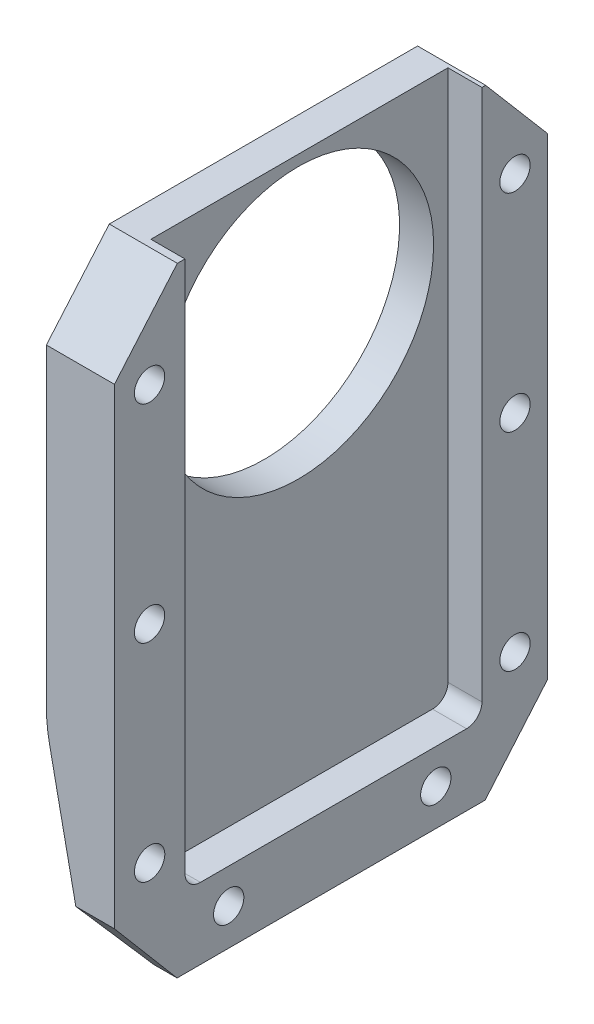
ISO-10303-21;
HEADER;
FILE_DESCRIPTION(('STEP AP214'),'2;1');
FILE_NAME('part.step','',(''),(''),'','','');
FILE_SCHEMA(('AUTOMOTIVE_DESIGN { 1 0 10303 214 1 1 1 1 }'));
ENDSEC;
DATA;
#1=APPLICATION_CONTEXT('core data for automotive mechanical design processes');
#2=APPLICATION_PROTOCOL_DEFINITION('international standard','automotive_design',2000,#1);
#3=PRODUCT_CONTEXT('',#1,'mechanical');
#4=PRODUCT('Part','Part','',(#3));
#5=PRODUCT_RELATED_PRODUCT_CATEGORY('part','',(#4));
#6=PRODUCT_DEFINITION_FORMATION('','',#4);
#7=PRODUCT_DEFINITION_CONTEXT('part definition',#1,'design');
#8=PRODUCT_DEFINITION('design','',#6,#7);
#9=PRODUCT_DEFINITION_SHAPE('','',#8);
#10=(LENGTH_UNIT() NAMED_UNIT(*) SI_UNIT(.MILLI.,.METRE.));
#11=(NAMED_UNIT(*) PLANE_ANGLE_UNIT() SI_UNIT($,.RADIAN.));
#12=(NAMED_UNIT(*) SI_UNIT($,.STERADIAN.) SOLID_ANGLE_UNIT());
#13=UNCERTAINTY_MEASURE_WITH_UNIT(LENGTH_MEASURE(1.E-05),#10,'distance_accuracy_value','');
#14=(GEOMETRIC_REPRESENTATION_CONTEXT(3) GLOBAL_UNCERTAINTY_ASSIGNED_CONTEXT((#13)) GLOBAL_UNIT_ASSIGNED_CONTEXT((#10,
#11,#12)) REPRESENTATION_CONTEXT('',''));
#15=CARTESIAN_POINT('',(0.,0.,0.));
#16=DIRECTION('',(0.,0.,1.));
#17=DIRECTION('',(1.,0.,0.));
#18=AXIS2_PLACEMENT_3D('',#15,#16,#17);
#19=CARTESIAN_POINT('',(-1.91664376205864,0.,35.56));
#20=DIRECTION('',(0.,1.,0.));
#21=DIRECTION('',(0.,0.,1.));
#22=AXIS2_PLACEMENT_3D('',#19,#20,#21);
#23=PLANE('',#22);
#24=DIRECTION('',(0.,0.,-1.));
#25=VECTOR('',#24,1.);
#26=CARTESIAN_POINT('',(-1.91664376205864,0.,35.56));
#27=LINE('',#26,#25);
#28=CARTESIAN_POINT('',(-1.91664376205864,0.,30.4170918583045));
#29=VERTEX_POINT('',#28);
#30=CARTESIAN_POINT('',(-1.91664376205864,0.,5.12869281639009));
#31=VERTEX_POINT('',#30);
#32=EDGE_CURVE('E195',#29,#31,#27,.T.);
#33=ORIENTED_EDGE('',*,*,#32,.T.);
#34=DIRECTION('',(1.,0.,0.));
#35=VECTOR('',#34,1.);
#36=CARTESIAN_POINT('',(-5.588,0.,5.12869281639009));
#37=LINE('',#36,#35);
#38=CARTESIAN_POINT('',(0.,0.,5.12869281639009));
#39=VERTEX_POINT('',#38);
#40=EDGE_CURVE('E306',#31,#39,#37,.T.);
#41=ORIENTED_EDGE('',*,*,#40,.T.);
#42=DIRECTION('',(0.,0.,-1.));
#43=VECTOR('',#42,1.);
#44=CARTESIAN_POINT('',(0.,0.,35.56));
#45=LINE('',#44,#43);
#46=CARTESIAN_POINT('',(0.,0.,30.4170918583045));
#47=VERTEX_POINT('',#46);
#48=EDGE_CURVE('E206',#47,#39,#45,.T.);
#49=ORIENTED_EDGE('',*,*,#48,.F.);
#50=DIRECTION('',(1.,0.,0.));
#51=VECTOR('',#50,1.);
#52=CARTESIAN_POINT('',(-5.588,0.,30.4170918583045));
#53=LINE('',#52,#51);
#54=EDGE_CURVE('E254',#29,#47,#53,.T.);
#55=ORIENTED_EDGE('',*,*,#54,.F.);
#56=EDGE_LOOP('',(#33,#41,#49,#55));
#57=FACE_BOUND('',#56,.T.);
#58=ADVANCED_FACE('F43',(#57),#23,.F.);
#59=CARTESIAN_POINT('',(0.,0.,35.56));
#60=DIRECTION('',(-1.,0.,0.));
#61=DIRECTION('',(0.,0.,1.));
#62=AXIS2_PLACEMENT_3D('',#59,#60,#61);
#63=PLANE('',#62);
#64=CARTESIAN_POINT('',(0.,43.3095233691544,2.67853591924794));
#65=DIRECTION('',(-1.,0.,0.));
#66=DIRECTION('',(0.,0.,1.));
#67=AXIS2_PLACEMENT_3D('',#64,#65,#66);
#68=CIRCLE('',#67,1.24459999999998);
#69=CARTESIAN_POINT('',(0.,43.3095233691544,3.92313591924793));
#70=VERTEX_POINT('',#69);
#71=EDGE_CURVE('E780',#70,#70,#68,.T.);
#72=ORIENTED_EDGE('',*,*,#71,.T.);
#73=EDGE_LOOP('',(#72));
#74=FACE_BOUND('',#73,.T.);
#75=CARTESIAN_POINT('',(0.,26.3095233691544,2.67853591924794));
#76=DIRECTION('',(-1.,0.,0.));
#77=DIRECTION('',(0.,0.,1.));
#78=AXIS2_PLACEMENT_3D('',#75,#76,#77);
#79=CIRCLE('',#78,1.24459999999999);
#80=CARTESIAN_POINT('',(0.,26.3095233691544,3.92313591924793));
#81=VERTEX_POINT('',#80);
#82=EDGE_CURVE('E794',#81,#81,#79,.T.);
#83=ORIENTED_EDGE('',*,*,#82,.T.);
#84=EDGE_LOOP('',(#83));
#85=FACE_BOUND('',#84,.T.);
#86=CARTESIAN_POINT('',(0.,9.30952336915439,2.67853591924794));
#87=DIRECTION('',(-1.,0.,0.));
#88=DIRECTION('',(0.,0.,1.));
#89=AXIS2_PLACEMENT_3D('',#86,#87,#88);
#90=CIRCLE('',#89,1.24459999999999);
#91=CARTESIAN_POINT('',(0.,9.30952336915439,3.92313591924793));
#92=VERTEX_POINT('',#91);
#93=EDGE_CURVE('E798',#92,#92,#90,.T.);
#94=ORIENTED_EDGE('',*,*,#93,.T.);
#95=EDGE_LOOP('',(#94));
#96=FACE_BOUND('',#95,.T.);
#97=CARTESIAN_POINT('',(0.,3.00952336915439,9.17853591924794));
#98=DIRECTION('',(-1.,0.,0.));
#99=DIRECTION('',(0.,0.,1.));
#100=AXIS2_PLACEMENT_3D('',#97,#98,#99);
#101=CIRCLE('',#100,1.24459999999999);
#102=CARTESIAN_POINT('',(0.,3.00952336915439,10.4231359192479));
#103=VERTEX_POINT('',#102);
#104=EDGE_CURVE('E806',#103,#103,#101,.T.);
#105=ORIENTED_EDGE('',*,*,#104,.T.);
#106=EDGE_LOOP('',(#105));
#107=FACE_BOUND('',#106,.T.);
#108=CARTESIAN_POINT('',(0.,2.9991799424324,26.181895158461));
#109=DIRECTION('',(-1.,0.,0.));
#110=DIRECTION('',(0.,0.,1.));
#111=AXIS2_PLACEMENT_3D('',#108,#109,#110);
#112=CIRCLE('',#111,1.24459999999999);
#113=CARTESIAN_POINT('',(0.,2.9991799424324,27.4264951584609));
#114=VERTEX_POINT('',#113);
#115=EDGE_CURVE('E274',#114,#114,#112,.T.);
#116=ORIENTED_EDGE('',*,*,#115,.T.);
#117=EDGE_LOOP('',(#116));
#118=FACE_BOUND('',#117,.T.);
#119=CARTESIAN_POINT('',(0.,9.30952336915439,32.6729446921815));
#120=DIRECTION('',(-1.,0.,0.));
#121=DIRECTION('',(0.,0.,1.));
#122=AXIS2_PLACEMENT_3D('',#119,#120,#121);
#123=CIRCLE('',#122,1.24459999999999);
#124=CARTESIAN_POINT('',(0.,9.30952336915439,33.9175446921815));
#125=VERTEX_POINT('',#124);
#126=EDGE_CURVE('E260',#125,#125,#123,.T.);
#127=ORIENTED_EDGE('',*,*,#126,.T.);
#128=EDGE_LOOP('',(#127));
#129=FACE_BOUND('',#128,.T.);
#130=CARTESIAN_POINT('',(0.,26.3095233691544,32.6785359192479));
#131=DIRECTION('',(-1.,0.,0.));
#132=DIRECTION('',(0.,0.,1.));
#133=AXIS2_PLACEMENT_3D('',#130,#131,#132);
#134=CIRCLE('',#133,1.24459999999999);
#135=CARTESIAN_POINT('',(0.,26.3095233691544,33.9231359192479));
#136=VERTEX_POINT('',#135);
#137=EDGE_CURVE('E281',#136,#136,#134,.T.);
#138=ORIENTED_EDGE('',*,*,#137,.T.);
#139=EDGE_LOOP('',(#138));
#140=FACE_BOUND('',#139,.T.);
#141=CARTESIAN_POINT('',(0.,43.3095233691544,32.6785359192479));
#142=DIRECTION('',(-1.,0.,0.));
#143=DIRECTION('',(0.,0.,1.));
#144=AXIS2_PLACEMENT_3D('',#141,#142,#143);
#145=CIRCLE('',#144,1.24459999999998);
#146=CARTESIAN_POINT('',(0.,43.3095233691544,33.9231359192479));
#147=VERTEX_POINT('',#146);
#148=EDGE_CURVE('E293',#147,#147,#145,.T.);
#149=ORIENTED_EDGE('',*,*,#148,.T.);
#150=EDGE_LOOP('',(#149));
#151=FACE_BOUND('',#150,.T.);
#152=DIRECTION('',(0.,1.,0.));
#153=VECTOR('',#152,1.);
#154=CARTESIAN_POINT('',(0.,0.,0.));
#155=LINE('',#154,#153);
#156=CARTESIAN_POINT('',(0.,6.02953117205409,0.));
#157=VERTEX_POINT('',#156);
#158=CARTESIAN_POINT('',(0.,44.8248953626975,0.));
#159=VERTEX_POINT('',#158);
#160=EDGE_CURVE('E184',#157,#159,#155,.T.);
#161=ORIENTED_EDGE('',*,*,#160,.T.);
#162=DIRECTION('',(0.,-0.761517392748183,-0.648144475053216));
#163=VECTOR('',#162,1.);
#164=CARTESIAN_POINT('',(0.,44.8248953626975,0.));
#165=LINE('',#164,#163);
#166=CARTESIAN_POINT('',(0.,50.8,5.08554511743511));
#167=VERTEX_POINT('',#166);
#168=EDGE_CURVE('E68',#167,#159,#165,.T.);
#169=ORIENTED_EDGE('',*,*,#168,.F.);
#170=DIRECTION('',(0.,0.,-1.));
#171=VECTOR('',#170,1.);
#172=CARTESIAN_POINT('',(0.,50.8,35.56));
#173=LINE('',#172,#171);
#174=CARTESIAN_POINT('',(0.,50.8,5.38804272725211));
#175=VERTEX_POINT('',#174);
#176=EDGE_CURVE('E202',#175,#167,#173,.T.);
#177=ORIENTED_EDGE('',*,*,#176,.F.);
#178=DIRECTION('',(0.,1.,0.));
#179=VECTOR('',#178,1.);
#180=CARTESIAN_POINT('',(0.,50.8,5.38804272725211));
#181=LINE('',#180,#179);
#182=CARTESIAN_POINT('',(0.,7.11199999999999,5.3880427272521));
#183=VERTEX_POINT('',#182);
#184=EDGE_CURVE('E343',#183,#175,#181,.T.);
#185=ORIENTED_EDGE('',*,*,#184,.F.);
#186=CARTESIAN_POINT('',(0.,7.11199999999999,6.6580427272521));
#187=DIRECTION('',(-1.,0.,0.));
#188=DIRECTION('',(0.,0.,1.));
#189=AXIS2_PLACEMENT_3D('',#186,#187,#188);
#190=CIRCLE('',#189,1.27);
#191=CARTESIAN_POINT('',(0.,5.84199999999999,6.6580427272521));
#192=VERTEX_POINT('',#191);
#193=EDGE_CURVE('E245',#183,#192,#190,.T.);
#194=ORIENTED_EDGE('',*,*,#193,.T.);
#195=DIRECTION('',(0.,0.,-1.));
#196=VECTOR('',#195,1.);
#197=CARTESIAN_POINT('',(0.,5.84199999999999,29.7720427272521));
#198=LINE('',#197,#196);
#199=CARTESIAN_POINT('',(0.,5.84199999999999,28.5020427272521));
#200=VERTEX_POINT('',#199);
#201=EDGE_CURVE('E358',#200,#192,#198,.T.);
#202=ORIENTED_EDGE('',*,*,#201,.F.);
#203=CARTESIAN_POINT('',(0.,7.11199999999999,28.5020427272521));
#204=DIRECTION('',(-1.,0.,0.));
#205=DIRECTION('',(0.,0.,1.));
#206=AXIS2_PLACEMENT_3D('',#203,#204,#205);
#207=CIRCLE('',#206,1.27);
#208=CARTESIAN_POINT('',(0.,7.11199999999999,29.7720427272521));
#209=VERTEX_POINT('',#208);
#210=EDGE_CURVE('E242',#200,#209,#207,.T.);
#211=ORIENTED_EDGE('',*,*,#210,.T.);
#212=DIRECTION('',(0.,-1.,0.));
#213=VECTOR('',#212,1.);
#214=CARTESIAN_POINT('',(0.,50.8,29.7720427272521));
#215=LINE('',#214,#213);
#216=CARTESIAN_POINT('',(0.,50.8,29.7720427272521));
#217=VERTEX_POINT('',#216);
#218=EDGE_CURVE('E334',#217,#209,#215,.T.);
#219=ORIENTED_EDGE('',*,*,#218,.F.);
#220=CARTESIAN_POINT('',(0.,50.8,30.3975808510955));
#221=VERTEX_POINT('',#220);
#222=EDGE_CURVE('E203',#221,#217,#173,.T.);
#223=ORIENTED_EDGE('',*,*,#222,.F.);
#224=DIRECTION('',(0.,0.759083371781677,-0.650993421383473));
#225=VECTOR('',#224,1.);
#226=CARTESIAN_POINT('',(0.,44.780420684171,35.56));
#227=LINE('',#226,#225);
#228=CARTESIAN_POINT('',(0.,44.780420684171,35.56));
#229=VERTEX_POINT('',#228);
#230=EDGE_CURVE('E323',#229,#221,#227,.T.);
#231=ORIENTED_EDGE('',*,*,#230,.F.);
#232=DIRECTION('',(0.,1.,0.));
#233=VECTOR('',#232,1.);
#234=CARTESIAN_POINT('',(0.,0.,35.56));
#235=LINE('',#234,#233);
#236=CARTESIAN_POINT('',(0.,6.07121687996455,35.56));
#237=VERTEX_POINT('',#236);
#238=EDGE_CURVE('E189',#237,#229,#235,.T.);
#239=ORIENTED_EDGE('',*,*,#238,.F.);
#240=DIRECTION('',(0.,0.763031396083279,0.646361422573472));
#241=VECTOR('',#240,1.);
#242=CARTESIAN_POINT('',(0.,0.,30.4170918583045));
#243=LINE('',#242,#241);
#244=EDGE_CURVE('E60',#47,#237,#243,.T.);
#245=ORIENTED_EDGE('',*,*,#244,.F.);
#246=ORIENTED_EDGE('',*,*,#48,.T.);
#247=DIRECTION('',(0.,-0.761715388262673,0.647911774305611));
#248=VECTOR('',#247,1.);
#249=CARTESIAN_POINT('',(0.,6.02953117205409,0.));
#250=LINE('',#249,#248);
#251=EDGE_CURVE('E302',#157,#39,#250,.T.);
#252=ORIENTED_EDGE('',*,*,#251,.F.);
#253=EDGE_LOOP('',(#161,#169,#177,#185,#194,#202,#211,#219,#223,#231,#239,#245,#246,#252));
#254=FACE_BOUND('',#253,.T.);
#255=ADVANCED_FACE('F394',(#74,#85,#96,#107,#118,#129,#140,#151,#254),#63,.F.);
#256=CARTESIAN_POINT('',(0.,50.8,35.56));
#257=DIRECTION('',(0.,-1.,0.));
#258=DIRECTION('',(0.,0.,-1.));
#259=AXIS2_PLACEMENT_3D('',#256,#257,#258);
#260=PLANE('',#259);
#261=ORIENTED_EDGE('',*,*,#176,.T.);
#262=DIRECTION('',(1.,0.,0.));
#263=VECTOR('',#262,1.);
#264=CARTESIAN_POINT('',(-5.588,50.8,5.08554511743511));
#265=LINE('',#264,#263);
#266=CARTESIAN_POINT('',(-5.588,50.8,5.08554511743511));
#267=VERTEX_POINT('',#266);
#268=EDGE_CURVE('E165',#267,#167,#265,.T.);
#269=ORIENTED_EDGE('',*,*,#268,.F.);
#270=DIRECTION('',(0.,0.,-1.));
#271=VECTOR('',#270,1.);
#272=CARTESIAN_POINT('',(-5.588,50.8,35.56));
#273=LINE('',#272,#271);
#274=CARTESIAN_POINT('',(-5.588,50.8,30.3975808510955));
#275=VERTEX_POINT('',#274);
#276=EDGE_CURVE('E175',#275,#267,#273,.T.);
#277=ORIENTED_EDGE('',*,*,#276,.F.);
#278=DIRECTION('',(1.,0.,0.));
#279=VECTOR('',#278,1.);
#280=CARTESIAN_POINT('',(-5.588,50.8,30.3975808510955));
#281=LINE('',#280,#279);
#282=EDGE_CURVE('E330',#275,#221,#281,.T.);
#283=ORIENTED_EDGE('',*,*,#282,.T.);
#284=ORIENTED_EDGE('',*,*,#222,.T.);
#285=DIRECTION('',(1.,0.,0.));
#286=VECTOR('',#285,1.);
#287=CARTESIAN_POINT('',(-2.794,50.8,29.7720427272521));
#288=LINE('',#287,#286);
#289=CARTESIAN_POINT('',(-2.794,50.8,29.7720427272521));
#290=VERTEX_POINT('',#289);
#291=EDGE_CURVE('E191',#290,#217,#288,.T.);
#292=ORIENTED_EDGE('',*,*,#291,.F.);
#293=DIRECTION('',(0.,0.,1.));
#294=VECTOR('',#293,1.);
#295=CARTESIAN_POINT('',(-2.794,50.8,29.7720427272521));
#296=LINE('',#295,#294);
#297=CARTESIAN_POINT('',(-2.794,50.8,5.3880427272521));
#298=VERTEX_POINT('',#297);
#299=EDGE_CURVE('E350',#298,#290,#296,.T.);
#300=ORIENTED_EDGE('',*,*,#299,.F.);
#301=DIRECTION('',(1.,0.,0.));
#302=VECTOR('',#301,1.);
#303=CARTESIAN_POINT('',(-2.794,50.8,5.38804272725211));
#304=LINE('',#303,#302);
#305=EDGE_CURVE('E354',#298,#175,#304,.T.);
#306=ORIENTED_EDGE('',*,*,#305,.T.);
#307=EDGE_LOOP('',(#261,#269,#277,#283,#284,#292,#300,#306));
#308=FACE_BOUND('',#307,.T.);
#309=ADVANCED_FACE('F399',(#308),#260,.F.);
#310=CARTESIAN_POINT('',(-5.588,50.8,35.56));
#311=DIRECTION('',(1.,0.,0.));
#312=DIRECTION('',(0.,0.,-1.));
#313=AXIS2_PLACEMENT_3D('',#310,#311,#312);
#314=PLANE('',#313);
#315=CARTESIAN_POINT('',(-5.588,43.3095233691544,2.67853591924794));
#316=DIRECTION('',(-1.,0.,0.));
#317=DIRECTION('',(0.,0.,1.));
#318=AXIS2_PLACEMENT_3D('',#315,#316,#317);
#319=CIRCLE('',#318,1.8796);
#320=CARTESIAN_POINT('',(-5.588,43.3095233691544,4.55813591924795));
#321=VERTEX_POINT('',#320);
#322=EDGE_CURVE('E776',#321,#321,#319,.T.);
#323=ORIENTED_EDGE('',*,*,#322,.F.);
#324=EDGE_LOOP('',(#323));
#325=FACE_BOUND('',#324,.T.);
#326=CARTESIAN_POINT('',(-5.588,26.3095233691544,2.67853591924794));
#327=DIRECTION('',(-1.,0.,0.));
#328=DIRECTION('',(0.,0.,1.));
#329=AXIS2_PLACEMENT_3D('',#326,#327,#328);
#330=CIRCLE('',#329,1.8796);
#331=CARTESIAN_POINT('',(-5.588,26.3095233691544,4.55813591924794));
#332=VERTEX_POINT('',#331);
#333=EDGE_CURVE('E786',#332,#332,#330,.T.);
#334=ORIENTED_EDGE('',*,*,#333,.F.);
#335=EDGE_LOOP('',(#334));
#336=FACE_BOUND('',#335,.T.);
#337=CARTESIAN_POINT('',(-5.588,26.3095233691544,32.6785359192479));
#338=DIRECTION('',(-1.,0.,0.));
#339=DIRECTION('',(0.,0.,1.));
#340=AXIS2_PLACEMENT_3D('',#337,#338,#339);
#341=CIRCLE('',#340,1.8796);
#342=CARTESIAN_POINT('',(-5.588,26.3095233691544,34.5581359192479));
#343=VERTEX_POINT('',#342);
#344=EDGE_CURVE('E259',#343,#343,#341,.T.);
#345=ORIENTED_EDGE('',*,*,#344,.F.);
#346=EDGE_LOOP('',(#345));
#347=FACE_BOUND('',#346,.T.);
#348=CARTESIAN_POINT('',(-5.588,43.3095233691544,32.6785359192479));
#349=DIRECTION('',(-1.,0.,0.));
#350=DIRECTION('',(0.,0.,1.));
#351=AXIS2_PLACEMENT_3D('',#348,#349,#350);
#352=CIRCLE('',#351,1.8796);
#353=CARTESIAN_POINT('',(-5.588,43.3095233691544,34.5581359192479));
#354=VERTEX_POINT('',#353);
#355=EDGE_CURVE('E285',#354,#354,#352,.T.);
#356=ORIENTED_EDGE('',*,*,#355,.F.);
#357=EDGE_LOOP('',(#356));
#358=FACE_BOUND('',#357,.T.);
#359=CARTESIAN_POINT('',(-5.588,38.8095233691544,17.6785359192479));
#360=DIRECTION('',(-1.,0.,0.));
#361=DIRECTION('',(0.,0.,1.));
#362=AXIS2_PLACEMENT_3D('',#359,#360,#361);
#363=CIRCLE('',#362,11.1125);
#364=CARTESIAN_POINT('',(-5.588,38.8095233691544,28.7910359192479));
#365=VERTEX_POINT('',#364);
#366=EDGE_CURVE('E255',#365,#365,#363,.T.);
#367=ORIENTED_EDGE('',*,*,#366,.F.);
#368=EDGE_LOOP('',(#367));
#369=FACE_BOUND('',#368,.T.);
#370=ORIENTED_EDGE('',*,*,#276,.T.);
#371=DIRECTION('',(0.,-0.761517392748183,-0.648144475053216));
#372=VECTOR('',#371,1.);
#373=CARTESIAN_POINT('',(-5.588,44.8248953626975,0.));
#374=LINE('',#373,#372);
#375=CARTESIAN_POINT('',(-5.588,44.8248953626975,0.));
#376=VERTEX_POINT('',#375);
#377=EDGE_CURVE('E158',#267,#376,#374,.T.);
#378=ORIENTED_EDGE('',*,*,#377,.T.);
#379=DIRECTION('',(0.,-1.,0.));
#380=VECTOR('',#379,1.);
#381=CARTESIAN_POINT('',(-5.588,50.8,0.));
#382=LINE('',#381,#380);
#383=CARTESIAN_POINT('',(-5.588,19.0775124180395,0.));
#384=VERTEX_POINT('',#383);
#385=EDGE_CURVE('E171',#376,#384,#382,.T.);
#386=ORIENTED_EDGE('',*,*,#385,.T.);
#387=DIRECTION('',(0.,0.,-1.));
#388=VECTOR('',#387,1.);
#389=CARTESIAN_POINT('',(-5.588,19.0775124180395,35.56));
#390=LINE('',#389,#388);
#391=CARTESIAN_POINT('',(-5.588,19.0775124180395,35.56));
#392=VERTEX_POINT('',#391);
#393=EDGE_CURVE('E216',#384,#392,#390,.F.);
#394=ORIENTED_EDGE('',*,*,#393,.T.);
#395=DIRECTION('',(0.,-1.,0.));
#396=VECTOR('',#395,1.);
#397=CARTESIAN_POINT('',(-5.588,50.8,35.56));
#398=LINE('',#397,#396);
#399=CARTESIAN_POINT('',(-5.588,44.780420684171,35.56));
#400=VERTEX_POINT('',#399);
#401=EDGE_CURVE('E372',#400,#392,#398,.T.);
#402=ORIENTED_EDGE('',*,*,#401,.F.);
#403=DIRECTION('',(0.,0.759083371781677,-0.650993421383473));
#404=VECTOR('',#403,1.);
#405=CARTESIAN_POINT('',(-5.588,44.780420684171,35.56));
#406=LINE('',#405,#404);
#407=EDGE_CURVE('E324',#400,#275,#406,.T.);
#408=ORIENTED_EDGE('',*,*,#407,.T.);
#409=EDGE_LOOP('',(#370,#378,#386,#394,#402,#408));
#410=FACE_BOUND('',#409,.T.);
#411=ADVANCED_FACE('F169',(#325,#336,#347,#358,#369,#410),#314,.F.);
#412=CARTESIAN_POINT('',(-5.588,17.78,35.56));
#413=DIRECTION('',(0.979339732195538,0.20222188047581,0.));
#414=DIRECTION('',(-0.20222188047581,0.979339732195538,0.));
#415=AXIS2_PLACEMENT_3D('',#412,#413,#414);
#416=PLANE('',#415);
#417=CARTESIAN_POINT('',(-3.8389484129926,9.30952336915439,2.67853591924794));
#418=DIRECTION('',(0.979339732195538,0.20222188047581,0.));
#419=DIRECTION('',(-0.20222188047581,0.979339732195538,0.));
#420=AXIS2_PLACEMENT_3D('',#417,#418,#419);
#421=ELLIPSE('',#420,1.27085623005387,1.24459999999999);
#422=CARTESIAN_POINT('',(-4.0959433496485,10.5541233691544,2.67853591924794));
#423=VERTEX_POINT('',#422);
#424=EDGE_CURVE('E802',#423,#423,#421,.T.);
#425=ORIENTED_EDGE('',*,*,#424,.T.);
#426=EDGE_LOOP('',(#425));
#427=FACE_BOUND('',#426,.T.);
#428=CARTESIAN_POINT('',(-2.53807415545433,3.00952336915439,9.17853591924794));
#429=DIRECTION('',(0.979339732195538,0.20222188047581,0.));
#430=DIRECTION('',(-0.20222188047581,0.979339732195538,0.));
#431=AXIS2_PLACEMENT_3D('',#428,#429,#430);
#432=ELLIPSE('',#431,1.27085623005388,1.24459999999999);
#433=CARTESIAN_POINT('',(-2.79506909211022,4.25412336915439,9.17853591924794));
#434=VERTEX_POINT('',#433);
#435=EDGE_CURVE('E809',#434,#434,#432,.T.);
#436=ORIENTED_EDGE('',*,*,#435,.T.);
#437=EDGE_LOOP('',(#436));
#438=FACE_BOUND('',#437,.T.);
#439=CARTESIAN_POINT('',(-2.53593836219125,2.9991799424324,26.181895158461));
#440=DIRECTION('',(0.979339732195538,0.20222188047581,0.));
#441=DIRECTION('',(-0.20222188047581,0.979339732195538,0.));
#442=AXIS2_PLACEMENT_3D('',#439,#440,#441);
#443=ELLIPSE('',#442,1.27085623005388,1.24459999999999);
#444=CARTESIAN_POINT('',(-2.79293329884715,4.24377994243239,26.181895158461));
#445=VERTEX_POINT('',#444);
#446=EDGE_CURVE('E47',#445,#445,#443,.T.);
#447=ORIENTED_EDGE('',*,*,#446,.T.);
#448=EDGE_LOOP('',(#447));
#449=FACE_BOUND('',#448,.T.);
#450=CARTESIAN_POINT('',(-3.8389484129926,9.30952336915439,32.6729446921815));
#451=DIRECTION('',(0.979339732195538,0.20222188047581,0.));
#452=DIRECTION('',(-0.20222188047581,0.979339732195538,0.));
#453=AXIS2_PLACEMENT_3D('',#450,#451,#452);
#454=ELLIPSE('',#453,1.27085623005387,1.24459999999999);
#455=CARTESIAN_POINT('',(-4.0959433496485,10.5541233691544,32.6729446921815));
#456=VERTEX_POINT('',#455);
#457=EDGE_CURVE('E256',#456,#456,#454,.T.);
#458=ORIENTED_EDGE('',*,*,#457,.T.);
#459=EDGE_LOOP('',(#458));
#460=FACE_BOUND('',#459,.T.);
#461=DIRECTION('',(0.20222188047581,-0.979339732195537,0.));
#462=VECTOR('',#461,1.);
#463=CARTESIAN_POINT('',(-5.588,17.78,0.));
#464=LINE('',#463,#462);
#465=CARTESIAN_POINT('',(-5.32561459888333,16.5092945359968,0.));
#466=VERTEX_POINT('',#465);
#467=CARTESIAN_POINT('',(-3.16166945836813,6.02953117205409,0.));
#468=VERTEX_POINT('',#467);
#469=EDGE_CURVE('E183',#466,#468,#464,.T.);
#470=ORIENTED_EDGE('',*,*,#469,.T.);
#471=DIRECTION('',(0.155374932595926,-0.752464790260893,0.640043256146366));
#472=VECTOR('',#471,1.);
#473=CARTESIAN_POINT('',(-1.05771680292443,-4.15969476772149,8.666910973793));
#474=LINE('',#473,#472);
#475=EDGE_CURVE('E304',#468,#31,#474,.T.);
#476=ORIENTED_EDGE('',*,*,#475,.T.);
#477=ORIENTED_EDGE('',*,*,#32,.F.);
#478=DIRECTION('',(-0.155636875365988,0.753733352108303,0.638485079658008));
#479=VECTOR('',#478,1.);
#480=CARTESIAN_POINT('',(-4.60238333527081,13.0067600409402,41.4350761329861));
#481=LINE('',#480,#479);
#482=CARTESIAN_POINT('',(-3.1702770558805,6.07121687996455,35.56));
#483=VERTEX_POINT('',#482);
#484=EDGE_CURVE('E319',#29,#483,#481,.T.);
#485=ORIENTED_EDGE('',*,*,#484,.T.);
#486=DIRECTION('',(0.20222188047581,-0.979339732195537,0.));
#487=VECTOR('',#486,1.);
#488=CARTESIAN_POINT('',(-5.588,17.78,35.56));
#489=LINE('',#488,#487);
#490=CARTESIAN_POINT('',(-5.32561459888333,16.5092945359968,35.56));
#491=VERTEX_POINT('',#490);
#492=EDGE_CURVE('E199',#491,#483,#489,.T.);
#493=ORIENTED_EDGE('',*,*,#492,.F.);
#494=DIRECTION('',(0.,0.,-1.));
#495=VECTOR('',#494,1.);
#496=CARTESIAN_POINT('',(-5.32561459888333,16.5092945359968,35.56));
#497=LINE('',#496,#495);
#498=EDGE_CURVE('E210',#491,#466,#497,.T.);
#499=ORIENTED_EDGE('',*,*,#498,.T.);
#500=EDGE_LOOP('',(#470,#476,#477,#485,#493,#499));
#501=FACE_BOUND('',#500,.T.);
#502=ADVANCED_FACE('F383',(#427,#438,#449,#460,#501),#416,.F.);
#503=CARTESIAN_POINT('',(0.,0.,35.56));
#504=DIRECTION('',(0.,0.,1.));
#505=DIRECTION('',(1.,0.,0.));
#506=AXIS2_PLACEMENT_3D('',#503,#504,#505);
#507=PLANE('',#506);
#508=DIRECTION('',(-1.,0.,0.));
#509=VECTOR('',#508,1.);
#510=CARTESIAN_POINT('',(0.,6.07121687996455,35.56));
#511=LINE('',#510,#509);
#512=EDGE_CURVE('E11',#237,#483,#511,.T.);
#513=ORIENTED_EDGE('',*,*,#512,.F.);
#514=ORIENTED_EDGE('',*,*,#238,.T.);
#515=DIRECTION('',(1.,0.,0.));
#516=VECTOR('',#515,1.);
#517=CARTESIAN_POINT('',(-5.588,44.780420684171,35.56));
#518=LINE('',#517,#516);
#519=EDGE_CURVE('E327',#400,#229,#518,.T.);
#520=ORIENTED_EDGE('',*,*,#519,.F.);
#521=ORIENTED_EDGE('',*,*,#401,.T.);
#522=CARTESIAN_POINT('',(7.112,19.0775124180395,35.56));
#523=DIRECTION('',(0.,0.,1.));
#524=DIRECTION('',(1.,0.,0.));
#525=AXIS2_PLACEMENT_3D('',#522,#523,#524);
#526=CIRCLE('',#525,12.7);
#527=EDGE_CURVE('E219',#392,#491,#526,.T.);
#528=ORIENTED_EDGE('',*,*,#527,.T.);
#529=ORIENTED_EDGE('',*,*,#492,.T.);
#530=EDGE_LOOP('',(#513,#514,#520,#521,#528,#529));
#531=FACE_BOUND('',#530,.T.);
#532=ADVANCED_FACE('F378',(#531),#507,.T.);
#533=CARTESIAN_POINT('',(0.,0.,0.));
#534=DIRECTION('',(0.,0.,1.));
#535=DIRECTION('',(1.,0.,0.));
#536=AXIS2_PLACEMENT_3D('',#533,#534,#535);
#537=PLANE('',#536);
#538=ORIENTED_EDGE('',*,*,#385,.F.);
#539=DIRECTION('',(1.,0.,0.));
#540=VECTOR('',#539,1.);
#541=CARTESIAN_POINT('',(-5.588,44.8248953626975,0.));
#542=LINE('',#541,#540);
#543=EDGE_CURVE('E155',#376,#159,#542,.T.);
#544=ORIENTED_EDGE('',*,*,#543,.T.);
#545=ORIENTED_EDGE('',*,*,#160,.F.);
#546=DIRECTION('',(-1.,0.,0.));
#547=VECTOR('',#546,1.);
#548=CARTESIAN_POINT('',(0.,6.02953117205409,0.));
#549=LINE('',#548,#547);
#550=EDGE_CURVE('E53',#157,#468,#549,.T.);
#551=ORIENTED_EDGE('',*,*,#550,.T.);
#552=ORIENTED_EDGE('',*,*,#469,.F.);
#553=CARTESIAN_POINT('',(7.112,19.0775124180395,0.));
#554=DIRECTION('',(0.,0.,1.));
#555=DIRECTION('',(1.,0.,0.));
#556=AXIS2_PLACEMENT_3D('',#553,#554,#555);
#557=CIRCLE('',#556,12.7);
#558=EDGE_CURVE('E180',#466,#384,#557,.F.);
#559=ORIENTED_EDGE('',*,*,#558,.T.);
#560=EDGE_LOOP('',(#538,#544,#545,#551,#552,#559));
#561=FACE_BOUND('',#560,.T.);
#562=ADVANCED_FACE('F178',(#561),#537,.F.);
#563=CARTESIAN_POINT('',(7.112,19.0775124180395,35.56));
#564=DIRECTION('',(0.,0.,-1.));
#565=DIRECTION('',(-1.,0.,0.));
#566=AXIS2_PLACEMENT_3D('',#563,#564,#565);
#567=CYLINDRICAL_SURFACE('',#566,12.7);
#568=ORIENTED_EDGE('',*,*,#527,.F.);
#569=ORIENTED_EDGE('',*,*,#393,.F.);
#570=ORIENTED_EDGE('',*,*,#558,.F.);
#571=ORIENTED_EDGE('',*,*,#498,.F.);
#572=EDGE_LOOP('',(#568,#569,#570,#571));
#573=FACE_BOUND('',#572,.T.);
#574=ADVANCED_FACE('F386',(#573),#567,.T.);
#575=CARTESIAN_POINT('',(-2.794,50.8,29.7720427272521));
#576=DIRECTION('',(0.,0.,1.));
#577=DIRECTION('',(0.,-1.,0.));
#578=AXIS2_PLACEMENT_3D('',#575,#576,#577);
#579=PLANE('',#578);
#580=ORIENTED_EDGE('',*,*,#218,.T.);
#581=DIRECTION('',(1.,0.,0.));
#582=VECTOR('',#581,1.);
#583=CARTESIAN_POINT('',(-2.794,7.11199999999999,29.7720427272521));
#584=LINE('',#583,#582);
#585=CARTESIAN_POINT('',(-2.794,7.11199999999999,29.7720427272521));
#586=VERTEX_POINT('',#585);
#587=EDGE_CURVE('E229',#209,#586,#584,.F.);
#588=ORIENTED_EDGE('',*,*,#587,.T.);
#589=DIRECTION('',(0.,-1.,0.));
#590=VECTOR('',#589,1.);
#591=CARTESIAN_POINT('',(-2.794,50.8,29.7720427272521));
#592=LINE('',#591,#590);
#593=EDGE_CURVE('E338',#290,#586,#592,.T.);
#594=ORIENTED_EDGE('',*,*,#593,.F.);
#595=ORIENTED_EDGE('',*,*,#291,.T.);
#596=EDGE_LOOP('',(#580,#588,#594,#595));
#597=FACE_BOUND('',#596,.T.);
#598=ADVANCED_FACE('F402',(#597),#579,.F.);
#599=CARTESIAN_POINT('',(-2.794,50.8,5.38804272725211));
#600=DIRECTION('',(0.,0.,-1.));
#601=DIRECTION('',(0.,1.,0.));
#602=AXIS2_PLACEMENT_3D('',#599,#600,#601);
#603=PLANE('',#602);
#604=DIRECTION('',(0.,1.,0.));
#605=VECTOR('',#604,1.);
#606=CARTESIAN_POINT('',(-2.794,50.8,5.38804272725211));
#607=LINE('',#606,#605);
#608=CARTESIAN_POINT('',(-2.794,7.11199999999999,5.3880427272521));
#609=VERTEX_POINT('',#608);
#610=EDGE_CURVE('E347',#609,#298,#607,.T.);
#611=ORIENTED_EDGE('',*,*,#610,.F.);
#612=DIRECTION('',(1.,0.,0.));
#613=VECTOR('',#612,1.);
#614=CARTESIAN_POINT('',(0.,7.11199999999999,5.3880427272521));
#615=LINE('',#614,#613);
#616=EDGE_CURVE('E238',#609,#183,#615,.T.);
#617=ORIENTED_EDGE('',*,*,#616,.T.);
#618=ORIENTED_EDGE('',*,*,#184,.T.);
#619=ORIENTED_EDGE('',*,*,#305,.F.);
#620=EDGE_LOOP('',(#611,#617,#618,#619));
#621=FACE_BOUND('',#620,.T.);
#622=ADVANCED_FACE('F461',(#621),#603,.F.);
#623=CARTESIAN_POINT('',(-2.794,5.84199999999999,29.7720427272521));
#624=DIRECTION('',(0.,-1.,0.));
#625=DIRECTION('',(0.,0.,-1.));
#626=AXIS2_PLACEMENT_3D('',#623,#624,#625);
#627=PLANE('',#626);
#628=DIRECTION('',(0.,0.,-1.));
#629=VECTOR('',#628,1.);
#630=CARTESIAN_POINT('',(-2.794,5.84199999999999,29.7720427272521));
#631=LINE('',#630,#629);
#632=CARTESIAN_POINT('',(-2.794,5.84199999999999,28.5020427272521));
#633=VERTEX_POINT('',#632);
#634=CARTESIAN_POINT('',(-2.794,5.84199999999999,6.6580427272521));
#635=VERTEX_POINT('',#634);
#636=EDGE_CURVE('E342',#633,#635,#631,.T.);
#637=ORIENTED_EDGE('',*,*,#636,.F.);
#638=DIRECTION('',(1.,0.,0.));
#639=VECTOR('',#638,1.);
#640=CARTESIAN_POINT('',(0.,5.84199999999999,28.5020427272521));
#641=LINE('',#640,#639);
#642=EDGE_CURVE('E225',#633,#200,#641,.T.);
#643=ORIENTED_EDGE('',*,*,#642,.T.);
#644=ORIENTED_EDGE('',*,*,#201,.T.);
#645=DIRECTION('',(1.,0.,0.));
#646=VECTOR('',#645,1.);
#647=CARTESIAN_POINT('',(-2.794,5.84199999999999,6.6580427272521));
#648=LINE('',#647,#646);
#649=EDGE_CURVE('E222',#192,#635,#648,.F.);
#650=ORIENTED_EDGE('',*,*,#649,.T.);
#651=EDGE_LOOP('',(#637,#643,#644,#650));
#652=FACE_BOUND('',#651,.T.);
#653=ADVANCED_FACE('F451',(#652),#627,.F.);
#654=CARTESIAN_POINT('',(-2.794,0.,0.));
#655=DIRECTION('',(1.,0.,0.));
#656=DIRECTION('',(0.,0.,-1.));
#657=AXIS2_PLACEMENT_3D('',#654,#655,#656);
#658=PLANE('',#657);
#659=CARTESIAN_POINT('',(-2.794,38.8095233691544,17.6785359192479));
#660=DIRECTION('',(1.,0.,0.));
#661=DIRECTION('',(0.,0.,-1.));
#662=AXIS2_PLACEMENT_3D('',#659,#660,#661);
#663=CIRCLE('',#662,11.1125);
#664=CARTESIAN_POINT('',(-2.794,38.8095233691544,6.56603591924795));
#665=VERTEX_POINT('',#664);
#666=EDGE_CURVE('E251',#665,#665,#663,.T.);
#667=ORIENTED_EDGE('',*,*,#666,.F.);
#668=EDGE_LOOP('',(#667));
#669=FACE_BOUND('',#668,.T.);
#670=ORIENTED_EDGE('',*,*,#593,.T.);
#671=CARTESIAN_POINT('',(-2.794,7.11199999999999,28.5020427272521));
#672=DIRECTION('',(1.,0.,0.));
#673=DIRECTION('',(0.,0.,-1.));
#674=AXIS2_PLACEMENT_3D('',#671,#672,#673);
#675=CIRCLE('',#674,1.27);
#676=EDGE_CURVE('E235',#586,#633,#675,.T.);
#677=ORIENTED_EDGE('',*,*,#676,.T.);
#678=ORIENTED_EDGE('',*,*,#636,.T.);
#679=CARTESIAN_POINT('',(-2.794,7.11199999999999,6.6580427272521));
#680=DIRECTION('',(1.,0.,0.));
#681=DIRECTION('',(0.,0.,-1.));
#682=AXIS2_PLACEMENT_3D('',#679,#680,#681);
#683=CIRCLE('',#682,1.27);
#684=EDGE_CURVE('E232',#635,#609,#683,.T.);
#685=ORIENTED_EDGE('',*,*,#684,.T.);
#686=ORIENTED_EDGE('',*,*,#610,.T.);
#687=ORIENTED_EDGE('',*,*,#299,.T.);
#688=EDGE_LOOP('',(#670,#677,#678,#685,#686,#687));
#689=FACE_BOUND('',#688,.T.);
#690=ADVANCED_FACE('F406',(#669,#689),#658,.T.);
#691=CARTESIAN_POINT('',(-2.794,7.11199999999999,28.5020427272521));
#692=DIRECTION('',(-1.,0.,0.));
#693=DIRECTION('',(0.,0.,1.));
#694=AXIS2_PLACEMENT_3D('',#691,#692,#693);
#695=CYLINDRICAL_SURFACE('',#694,1.27);
#696=ORIENTED_EDGE('',*,*,#676,.F.);
#697=ORIENTED_EDGE('',*,*,#587,.F.);
#698=ORIENTED_EDGE('',*,*,#210,.F.);
#699=ORIENTED_EDGE('',*,*,#642,.F.);
#700=EDGE_LOOP('',(#696,#697,#698,#699));
#701=FACE_BOUND('',#700,.T.);
#702=ADVANCED_FACE('F443',(#701),#695,.F.);
#703=CARTESIAN_POINT('',(-2.794,7.11199999999999,6.6580427272521));
#704=DIRECTION('',(-1.,0.,0.));
#705=DIRECTION('',(0.,0.,1.));
#706=AXIS2_PLACEMENT_3D('',#703,#704,#705);
#707=CYLINDRICAL_SURFACE('',#706,1.27);
#708=ORIENTED_EDGE('',*,*,#684,.F.);
#709=ORIENTED_EDGE('',*,*,#649,.F.);
#710=ORIENTED_EDGE('',*,*,#193,.F.);
#711=ORIENTED_EDGE('',*,*,#616,.F.);
#712=EDGE_LOOP('',(#708,#709,#710,#711));
#713=FACE_BOUND('',#712,.T.);
#714=ADVANCED_FACE('F45',(#713),#707,.F.);
#715=CARTESIAN_POINT('',(-5.588,44.780420684171,35.56));
#716=DIRECTION('',(0.,-0.650993421383473,-0.759083371781677));
#717=DIRECTION('',(0.,0.759083371781677,-0.650993421383473));
#718=AXIS2_PLACEMENT_3D('',#715,#716,#717);
#719=PLANE('',#718);
#720=ORIENTED_EDGE('',*,*,#230,.T.);
#721=ORIENTED_EDGE('',*,*,#282,.F.);
#722=ORIENTED_EDGE('',*,*,#407,.F.);
#723=ORIENTED_EDGE('',*,*,#519,.T.);
#724=EDGE_LOOP('',(#720,#721,#722,#723));
#725=FACE_BOUND('',#724,.T.);
#726=ADVANCED_FACE('F391',(#725),#719,.F.);
#727=CARTESIAN_POINT('',(-5.588,6.02953117205409,0.));
#728=DIRECTION('',(0.,0.647911774305611,0.761715388262673));
#729=DIRECTION('',(0.,-0.761715388262673,0.647911774305611));
#730=AXIS2_PLACEMENT_3D('',#727,#728,#729);
#731=PLANE('',#730);
#732=ORIENTED_EDGE('',*,*,#550,.F.);
#733=ORIENTED_EDGE('',*,*,#251,.T.);
#734=ORIENTED_EDGE('',*,*,#40,.F.);
#735=ORIENTED_EDGE('',*,*,#475,.F.);
#736=EDGE_LOOP('',(#732,#733,#734,#735));
#737=FACE_BOUND('',#736,.T.);
#738=ADVANCED_FACE('F429',(#737),#731,.F.);
#739=CARTESIAN_POINT('',(-5.588,44.8248953626975,0.));
#740=DIRECTION('',(0.,-0.648144475053216,0.761517392748183));
#741=DIRECTION('',(0.,-0.761517392748183,-0.648144475053216));
#742=AXIS2_PLACEMENT_3D('',#739,#740,#741);
#743=PLANE('',#742);
#744=ORIENTED_EDGE('',*,*,#168,.T.);
#745=ORIENTED_EDGE('',*,*,#543,.F.);
#746=ORIENTED_EDGE('',*,*,#377,.F.);
#747=ORIENTED_EDGE('',*,*,#268,.T.);
#748=EDGE_LOOP('',(#744,#745,#746,#747));
#749=FACE_BOUND('',#748,.T.);
#750=ADVANCED_FACE('F157',(#749),#743,.F.);
#751=CARTESIAN_POINT('',(-5.588,0.,30.4170918583045));
#752=DIRECTION('',(0.,0.646361422573472,-0.763031396083279));
#753=DIRECTION('',(0.,0.763031396083279,0.646361422573472));
#754=AXIS2_PLACEMENT_3D('',#751,#752,#753);
#755=PLANE('',#754);
#756=ORIENTED_EDGE('',*,*,#54,.T.);
#757=ORIENTED_EDGE('',*,*,#244,.T.);
#758=ORIENTED_EDGE('',*,*,#512,.T.);
#759=ORIENTED_EDGE('',*,*,#484,.F.);
#760=EDGE_LOOP('',(#756,#757,#758,#759));
#761=FACE_BOUND('',#760,.T.);
#762=ADVANCED_FACE('F418',(#761),#755,.F.);
#763=CARTESIAN_POINT('',(-5.588,38.8095233691544,17.6785359192479));
#764=DIRECTION('',(-1.,0.,0.));
#765=DIRECTION('',(0.,0.,1.));
#766=AXIS2_PLACEMENT_3D('',#763,#764,#765);
#767=CYLINDRICAL_SURFACE('',#766,11.1125);
#768=ORIENTED_EDGE('',*,*,#666,.T.);
#769=EDGE_LOOP('',(#768));
#770=FACE_BOUND('',#769,.T.);
#771=ORIENTED_EDGE('',*,*,#366,.T.);
#772=EDGE_LOOP('',(#771));
#773=FACE_BOUND('',#772,.T.);
#774=ADVANCED_FACE('F420',(#770,#773),#767,.F.);
#775=CARTESIAN_POINT('',(-5.588,43.3095233691544,32.6785359192479));
#776=DIRECTION('',(-1.,0.,0.));
#777=DIRECTION('',(0.,0.,1.));
#778=AXIS2_PLACEMENT_3D('',#775,#776,#777);
#779=CYLINDRICAL_SURFACE('',#778,1.24459999999999);
#780=ORIENTED_EDGE('',*,*,#148,.F.);
#781=EDGE_LOOP('',(#780));
#782=FACE_BOUND('',#781,.T.);
#783=CARTESIAN_POINT('',(-4.953,43.3095233691544,32.6785359192479));
#784=DIRECTION('',(-1.,0.,0.));
#785=DIRECTION('',(0.,0.,1.));
#786=AXIS2_PLACEMENT_3D('',#783,#784,#785);
#787=CIRCLE('',#786,1.2446);
#788=CARTESIAN_POINT('',(-4.953,43.3095233691544,33.9231359192479));
#789=VERTEX_POINT('',#788);
#790=EDGE_CURVE('E289',#789,#789,#787,.T.);
#791=ORIENTED_EDGE('',*,*,#790,.T.);
#792=EDGE_LOOP('',(#791));
#793=FACE_BOUND('',#792,.T.);
#794=ADVANCED_FACE('F426',(#782,#793),#779,.F.);
#795=CARTESIAN_POINT('',(-5.588,43.3095233691544,32.6785359192479));
#796=DIRECTION('',(-1.,0.,0.));
#797=DIRECTION('',(0.,0.,1.));
#798=AXIS2_PLACEMENT_3D('',#795,#796,#797);
#799=CONICAL_SURFACE('',#798,1.8796,0.78539816339745);
#800=ORIENTED_EDGE('',*,*,#790,.F.);
#801=EDGE_LOOP('',(#800));
#802=FACE_BOUND('',#801,.T.);
#803=ORIENTED_EDGE('',*,*,#355,.T.);
#804=EDGE_LOOP('',(#803));
#805=FACE_BOUND('',#804,.T.);
#806=ADVANCED_FACE('F624',(#802,#805),#799,.F.);
#807=CARTESIAN_POINT('',(-5.588,26.3095233691544,32.6785359192479));
#808=DIRECTION('',(-1.,0.,0.));
#809=DIRECTION('',(0.,0.,1.));
#810=AXIS2_PLACEMENT_3D('',#807,#808,#809);
#811=CYLINDRICAL_SURFACE('',#810,1.24459999999999);
#812=ORIENTED_EDGE('',*,*,#137,.F.);
#813=EDGE_LOOP('',(#812));
#814=FACE_BOUND('',#813,.T.);
#815=CARTESIAN_POINT('',(-4.953,26.3095233691544,32.6785359192479));
#816=DIRECTION('',(-1.,0.,0.));
#817=DIRECTION('',(0.,0.,1.));
#818=AXIS2_PLACEMENT_3D('',#815,#816,#817);
#819=CIRCLE('',#818,1.2446);
#820=CARTESIAN_POINT('',(-4.953,26.3095233691544,33.9231359192479));
#821=VERTEX_POINT('',#820);
#822=EDGE_CURVE('E266',#821,#821,#819,.T.);
#823=ORIENTED_EDGE('',*,*,#822,.T.);
#824=EDGE_LOOP('',(#823));
#825=FACE_BOUND('',#824,.T.);
#826=ADVANCED_FACE('F633',(#814,#825),#811,.F.);
#827=CARTESIAN_POINT('',(-5.588,26.3095233691544,32.6785359192479));
#828=DIRECTION('',(-1.,0.,0.));
#829=DIRECTION('',(0.,0.,1.));
#830=AXIS2_PLACEMENT_3D('',#827,#828,#829);
#831=CONICAL_SURFACE('',#830,1.8796,0.785398163397447);
#832=ORIENTED_EDGE('',*,*,#822,.F.);
#833=EDGE_LOOP('',(#832));
#834=FACE_BOUND('',#833,.T.);
#835=ORIENTED_EDGE('',*,*,#344,.T.);
#836=EDGE_LOOP('',(#835));
#837=FACE_BOUND('',#836,.T.);
#838=ADVANCED_FACE('F643',(#834,#837),#831,.F.);
#839=CARTESIAN_POINT('',(-5.588,9.30952336915439,32.6729446921815));
#840=DIRECTION('',(-1.,0.,0.));
#841=DIRECTION('',(0.,0.,1.));
#842=AXIS2_PLACEMENT_3D('',#839,#840,#841);
#843=CYLINDRICAL_SURFACE('',#842,1.24459999999999);
#844=ORIENTED_EDGE('',*,*,#126,.F.);
#845=EDGE_LOOP('',(#844));
#846=FACE_BOUND('',#845,.T.);
#847=ORIENTED_EDGE('',*,*,#457,.F.);
#848=EDGE_LOOP('',(#847));
#849=FACE_BOUND('',#848,.T.);
#850=ADVANCED_FACE('F653',(#846,#849),#843,.F.);
#851=CARTESIAN_POINT('',(-5.588,2.9991799424324,26.181895158461));
#852=DIRECTION('',(-1.,0.,0.));
#853=DIRECTION('',(0.,0.,1.));
#854=AXIS2_PLACEMENT_3D('',#851,#852,#853);
#855=CYLINDRICAL_SURFACE('',#854,1.24459999999999);
#856=ORIENTED_EDGE('',*,*,#115,.F.);
#857=EDGE_LOOP('',(#856));
#858=FACE_BOUND('',#857,.T.);
#859=ORIENTED_EDGE('',*,*,#446,.F.);
#860=EDGE_LOOP('',(#859));
#861=FACE_BOUND('',#860,.T.);
#862=ADVANCED_FACE('F663',(#858,#861),#855,.F.);
#863=CARTESIAN_POINT('',(-5.588,3.00952336915439,9.17853591924794));
#864=DIRECTION('',(-1.,0.,0.));
#865=DIRECTION('',(0.,0.,1.));
#866=AXIS2_PLACEMENT_3D('',#863,#864,#865);
#867=CYLINDRICAL_SURFACE('',#866,1.24459999999999);
#868=ORIENTED_EDGE('',*,*,#104,.F.);
#869=EDGE_LOOP('',(#868));
#870=FACE_BOUND('',#869,.T.);
#871=ORIENTED_EDGE('',*,*,#435,.F.);
#872=EDGE_LOOP('',(#871));
#873=FACE_BOUND('',#872,.T.);
#874=ADVANCED_FACE('F673',(#870,#873),#867,.F.);
#875=CARTESIAN_POINT('',(-5.588,9.30952336915439,2.67853591924794));
#876=DIRECTION('',(-1.,0.,0.));
#877=DIRECTION('',(0.,0.,1.));
#878=AXIS2_PLACEMENT_3D('',#875,#876,#877);
#879=CYLINDRICAL_SURFACE('',#878,1.24459999999999);
#880=ORIENTED_EDGE('',*,*,#93,.F.);
#881=EDGE_LOOP('',(#880));
#882=FACE_BOUND('',#881,.T.);
#883=ORIENTED_EDGE('',*,*,#424,.F.);
#884=EDGE_LOOP('',(#883));
#885=FACE_BOUND('',#884,.T.);
#886=ADVANCED_FACE('F683',(#882,#885),#879,.F.);
#887=CARTESIAN_POINT('',(-5.588,26.3095233691544,2.67853591924794));
#888=DIRECTION('',(-1.,0.,0.));
#889=DIRECTION('',(0.,0.,1.));
#890=AXIS2_PLACEMENT_3D('',#887,#888,#889);
#891=CYLINDRICAL_SURFACE('',#890,1.24459999999999);
#892=ORIENTED_EDGE('',*,*,#82,.F.);
#893=EDGE_LOOP('',(#892));
#894=FACE_BOUND('',#893,.T.);
#895=CARTESIAN_POINT('',(-4.953,26.3095233691544,2.67853591924794));
#896=DIRECTION('',(-1.,0.,0.));
#897=DIRECTION('',(0.,0.,1.));
#898=AXIS2_PLACEMENT_3D('',#895,#896,#897);
#899=CIRCLE('',#898,1.2446);
#900=CARTESIAN_POINT('',(-4.953,26.3095233691544,3.92313591924794));
#901=VERTEX_POINT('',#900);
#902=EDGE_CURVE('E790',#901,#901,#899,.T.);
#903=ORIENTED_EDGE('',*,*,#902,.T.);
#904=EDGE_LOOP('',(#903));
#905=FACE_BOUND('',#904,.T.);
#906=ADVANCED_FACE('F693',(#894,#905),#891,.F.);
#907=CARTESIAN_POINT('',(-5.588,26.3095233691544,2.67853591924794));
#908=DIRECTION('',(-1.,0.,0.));
#909=DIRECTION('',(0.,0.,1.));
#910=AXIS2_PLACEMENT_3D('',#907,#908,#909);
#911=CONICAL_SURFACE('',#910,1.8796,0.785398163397447);
#912=ORIENTED_EDGE('',*,*,#902,.F.);
#913=EDGE_LOOP('',(#912));
#914=FACE_BOUND('',#913,.T.);
#915=ORIENTED_EDGE('',*,*,#333,.T.);
#916=EDGE_LOOP('',(#915));
#917=FACE_BOUND('',#916,.T.);
#918=ADVANCED_FACE('F703',(#914,#917),#911,.F.);
#919=CARTESIAN_POINT('',(-5.588,43.3095233691544,2.67853591924794));
#920=DIRECTION('',(-1.,0.,0.));
#921=DIRECTION('',(0.,0.,1.));
#922=AXIS2_PLACEMENT_3D('',#919,#920,#921);
#923=CYLINDRICAL_SURFACE('',#922,1.24459999999999);
#924=ORIENTED_EDGE('',*,*,#71,.F.);
#925=EDGE_LOOP('',(#924));
#926=FACE_BOUND('',#925,.T.);
#927=CARTESIAN_POINT('',(-4.953,43.3095233691544,2.67853591924794));
#928=DIRECTION('',(-1.,0.,0.));
#929=DIRECTION('',(0.,0.,1.));
#930=AXIS2_PLACEMENT_3D('',#927,#928,#929);
#931=CIRCLE('',#930,1.2446);
#932=CARTESIAN_POINT('',(-4.953,43.3095233691544,3.92313591924794));
#933=VERTEX_POINT('',#932);
#934=EDGE_CURVE('E773',#933,#933,#931,.T.);
#935=ORIENTED_EDGE('',*,*,#934,.T.);
#936=EDGE_LOOP('',(#935));
#937=FACE_BOUND('',#936,.T.);
#938=ADVANCED_FACE('F713',(#926,#937),#923,.F.);
#939=CARTESIAN_POINT('',(-5.588,43.3095233691544,2.67853591924794));
#940=DIRECTION('',(-1.,0.,0.));
#941=DIRECTION('',(0.,0.,1.));
#942=AXIS2_PLACEMENT_3D('',#939,#940,#941);
#943=CONICAL_SURFACE('',#942,1.8796,0.78539816339745);
#944=ORIENTED_EDGE('',*,*,#934,.F.);
#945=EDGE_LOOP('',(#944));
#946=FACE_BOUND('',#945,.T.);
#947=ORIENTED_EDGE('',*,*,#322,.T.);
#948=EDGE_LOOP('',(#947));
#949=FACE_BOUND('',#948,.T.);
#950=ADVANCED_FACE('F723',(#946,#949),#943,.F.);
#951=CLOSED_SHELL('',(#58,#255,#309,#411,#502,#532,#562,#574,#598,#622,#653,#690,#702,#714,#726,
#738,#750,#762,#774,#794,#806,#826,#838,#850,#862,#874,#886,#906,#918,#938,#950));
#952=MANIFOLD_SOLID_BREP('B2',#951);
#953=ADVANCED_BREP_SHAPE_REPRESENTATION('',(#18,#952),#14);
#954=SHAPE_DEFINITION_REPRESENTATION(#9,#953);
ENDSEC;
END-ISO-10303-21;
